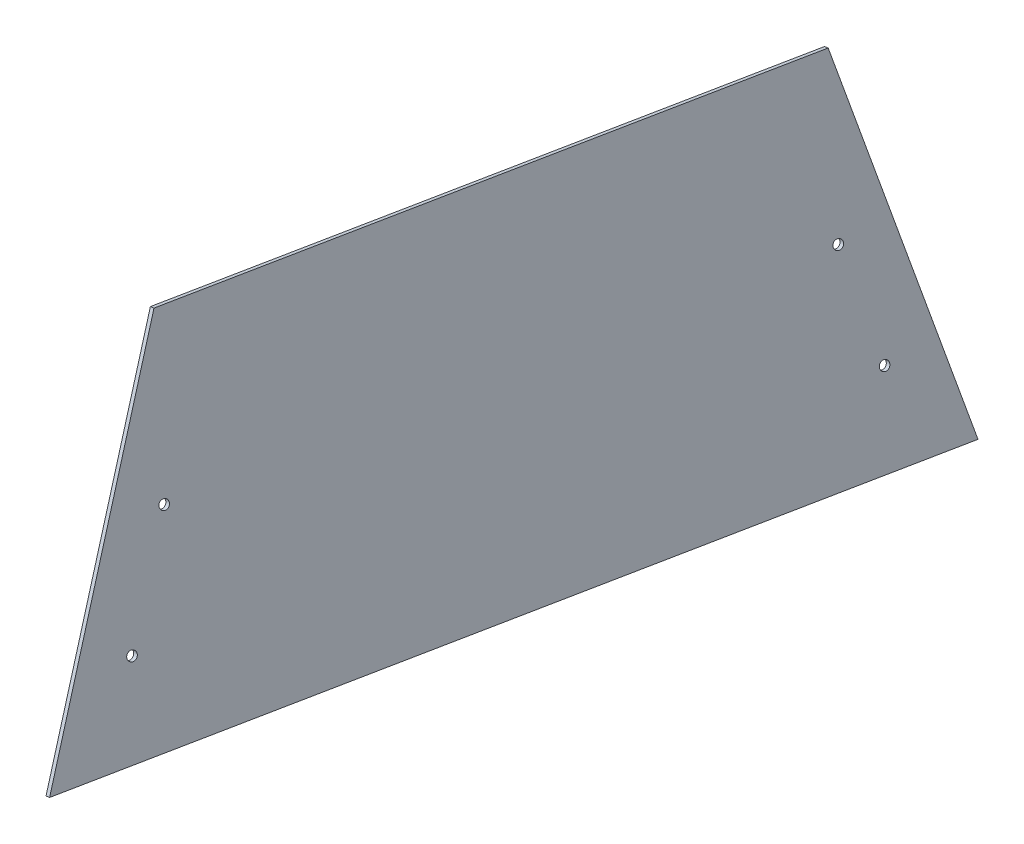
ISO-10303-21;
HEADER;
FILE_DESCRIPTION(('STEP AP214'),'2;1');
FILE_NAME('part.step','',(''),(''),'','','');
FILE_SCHEMA(('AUTOMOTIVE_DESIGN { 1 0 10303 214 1 1 1 1 }'));
ENDSEC;
DATA;
#1=APPLICATION_CONTEXT('core data for automotive mechanical design processes');
#2=APPLICATION_PROTOCOL_DEFINITION('international standard','automotive_design',2000,#1);
#3=PRODUCT_CONTEXT('',#1,'mechanical');
#4=PRODUCT('Part','Part','',(#3));
#5=PRODUCT_RELATED_PRODUCT_CATEGORY('part','',(#4));
#6=PRODUCT_DEFINITION_FORMATION('','',#4);
#7=PRODUCT_DEFINITION_CONTEXT('part definition',#1,'design');
#8=PRODUCT_DEFINITION('design','',#6,#7);
#9=PRODUCT_DEFINITION_SHAPE('','',#8);
#10=(LENGTH_UNIT() NAMED_UNIT(*) SI_UNIT(.MILLI.,.METRE.));
#11=(NAMED_UNIT(*) PLANE_ANGLE_UNIT() SI_UNIT($,.RADIAN.));
#12=(NAMED_UNIT(*) SI_UNIT($,.STERADIAN.) SOLID_ANGLE_UNIT());
#13=UNCERTAINTY_MEASURE_WITH_UNIT(LENGTH_MEASURE(1.E-05),#10,'distance_accuracy_value','');
#14=(GEOMETRIC_REPRESENTATION_CONTEXT(3) GLOBAL_UNCERTAINTY_ASSIGNED_CONTEXT((#13)) GLOBAL_UNIT_ASSIGNED_CONTEXT((#10,
#11,#12)) REPRESENTATION_CONTEXT('',''));
#15=CARTESIAN_POINT('',(0.,0.,0.));
#16=DIRECTION('',(0.,0.,1.));
#17=DIRECTION('',(1.,0.,0.));
#18=AXIS2_PLACEMENT_3D('',#15,#16,#17);
#19=CARTESIAN_POINT('',(267.040647517618,626.359113568149,1464.37896161702));
#20=DIRECTION('',(0.293132454914823,-0.954292497221213,0.058302603911916));
#21=DIRECTION('',(0.955918556350323,0.293631935635609,0.));
#22=AXIS2_PLACEMENT_3D('',#19,#20,#21);
#23=PLANE('',#22);
#24=DIRECTION('',(-0.195073763499262,8.02316137227276E-08,0.980788573951709));
#25=VECTOR('',#24,1.);
#26=CARTESIAN_POINT('',(264.232769971137,625.462490755744,1463.82048940084));
#27=LINE('',#26,#25);
#28=CARTESIAN_POINT('',(264.232769971137,625.462490755744,1463.82048940084));
#29=VERTEX_POINT('',#28);
#30=CARTESIAN_POINT('',(194.741215900189,625.462519336828,1813.2089514694));
#31=VERTEX_POINT('',#30);
#32=EDGE_CURVE('E101',#29,#31,#27,.T.);
#33=ORIENTED_EDGE('',*,*,#32,.T.);
#34=DIRECTION('',(-0.935959182160121,-0.298874270801778,-0.186157405393561));
#35=VECTOR('',#34,1.);
#36=CARTESIAN_POINT('',(197.549093446669,626.359142149233,1813.76742368558));
#37=LINE('',#36,#35);
#38=CARTESIAN_POINT('',(197.549093446669,626.359142149233,1813.76742368558));
#39=VERTEX_POINT('',#38);
#40=EDGE_CURVE('E11',#39,#31,#37,.T.);
#41=ORIENTED_EDGE('',*,*,#40,.F.);
#42=DIRECTION('',(-0.195073763499262,8.02316137227276E-08,0.980788573951709));
#43=VECTOR('',#42,1.);
#44=CARTESIAN_POINT('',(267.040647517618,626.359113568149,1464.37896161702));
#45=LINE('',#44,#43);
#46=CARTESIAN_POINT('',(267.040647517618,626.359113568149,1464.37896161702));
#47=VERTEX_POINT('',#46);
#48=EDGE_CURVE('E88',#47,#39,#45,.T.);
#49=ORIENTED_EDGE('',*,*,#48,.F.);
#50=DIRECTION('',(-0.935959182160121,-0.298874270801778,-0.186157405393561));
#51=VECTOR('',#50,1.);
#52=CARTESIAN_POINT('',(267.040647517618,626.359113568149,1464.37896161702));
#53=LINE('',#52,#51);
#54=EDGE_CURVE('E97',#47,#29,#53,.T.);
#55=ORIENTED_EDGE('',*,*,#54,.T.);
#56=EDGE_LOOP('',(#33,#41,#49,#55));
#57=FACE_BOUND('',#56,.T.);
#58=ADVANCED_FACE('F35',(#57),#23,.F.);
#59=CARTESIAN_POINT('',(197.549093446669,626.359142149233,1813.76742368558));
#60=DIRECTION('',(0.302048266778896,-0.409788813161848,-0.860720612709646));
#61=DIRECTION('',(0.,0.902892336228118,-0.429866757473209));
#62=AXIS2_PLACEMENT_3D('',#59,#60,#61);
#63=PLANE('',#62);
#64=DIRECTION('',(0.180962023270138,-0.86182788238726,0.473820057905813));
#65=VECTOR('',#64,1.);
#66=CARTESIAN_POINT('',(194.741215900189,625.462519336828,1813.2089514694));
#67=LINE('',#66,#65);
#68=CARTESIAN_POINT('',(234.816664307999,434.604027522417,1918.14009084357));
#69=VERTEX_POINT('',#68);
#70=EDGE_CURVE('E92',#31,#69,#67,.T.);
#71=ORIENTED_EDGE('',*,*,#70,.T.);
#72=DIRECTION('',(-0.935959182160121,-0.298874270801778,-0.186157405393561));
#73=VECTOR('',#72,1.);
#74=CARTESIAN_POINT('',(237.624541854479,435.500650334822,1918.69856305975));
#75=LINE('',#74,#73);
#76=CARTESIAN_POINT('',(237.624541854479,435.500650334822,1918.69856305975));
#77=VERTEX_POINT('',#76);
#78=EDGE_CURVE('E44',#77,#69,#75,.T.);
#79=ORIENTED_EDGE('',*,*,#78,.F.);
#80=DIRECTION('',(0.180962023270138,-0.86182788238726,0.473820057905813));
#81=VECTOR('',#80,1.);
#82=CARTESIAN_POINT('',(197.549093446669,626.359142149233,1813.76742368558));
#83=LINE('',#82,#81);
#84=EDGE_CURVE('E83',#39,#77,#83,.T.);
#85=ORIENTED_EDGE('',*,*,#84,.F.);
#86=ORIENTED_EDGE('',*,*,#40,.T.);
#87=EDGE_LOOP('',(#71,#79,#85,#86));
#88=FACE_BOUND('',#87,.T.);
#89=ADVANCED_FACE('F91',(#88),#63,.F.);
#90=CARTESIAN_POINT('',(237.624541854479,435.500650334822,1918.69856305975));
#91=DIRECTION('',(-0.293132454914823,0.954292497221213,-0.0583026039119154));
#92=DIRECTION('',(-0.955918556350323,-0.293631935635609,0.));
#93=AXIS2_PLACEMENT_3D('',#90,#91,#92);
#94=PLANE('',#93);
#95=DIRECTION('',(0.195073763499262,-8.02316132297327E-08,-0.980788573951709));
#96=VECTOR('',#95,1.);
#97=CARTESIAN_POINT('',(234.816664307999,434.604027522417,1918.14009084357));
#98=LINE('',#97,#96);
#99=CARTESIAN_POINT('',(330.512514301934,434.603988163806,1437.00211223988));
#100=VERTEX_POINT('',#99);
#101=EDGE_CURVE('E70',#69,#100,#98,.T.);
#102=ORIENTED_EDGE('',*,*,#101,.T.);
#103=DIRECTION('',(-0.935959182160121,-0.298874270801778,-0.186157405393561));
#104=VECTOR('',#103,1.);
#105=CARTESIAN_POINT('',(333.320391848414,435.500610976211,1437.56058445606));
#106=LINE('',#105,#104);
#107=CARTESIAN_POINT('',(333.320391848414,435.500610976211,1437.56058445606));
#108=VERTEX_POINT('',#107);
#109=EDGE_CURVE('E93',#108,#100,#106,.T.);
#110=ORIENTED_EDGE('',*,*,#109,.F.);
#111=DIRECTION('',(0.195073763499262,-8.02316132297327E-08,-0.980788573951709));
#112=VECTOR('',#111,1.);
#113=CARTESIAN_POINT('',(237.624541854479,435.500650334822,1918.69856305975));
#114=LINE('',#113,#112);
#115=EDGE_CURVE('E86',#77,#108,#114,.T.);
#116=ORIENTED_EDGE('',*,*,#115,.F.);
#117=ORIENTED_EDGE('',*,*,#78,.T.);
#118=EDGE_LOOP('',(#102,#110,#116,#117));
#119=FACE_BOUND('',#118,.T.);
#120=ADVANCED_FACE('F95',(#119),#94,.F.);
#121=CARTESIAN_POINT('',(333.320391848414,435.500610976211,1437.56058445606));
#122=DIRECTION('',(-0.134999140998528,-0.183695914556916,0.973668856904008));
#123=DIRECTION('',(0.,-0.982664446815739,-0.185393055329261));
#124=AXIS2_PLACEMENT_3D('',#121,#122,#123);
#125=PLANE('',#124);
#126=DIRECTION('',(-0.325200924444898,0.936445396821301,0.131584108130046));
#127=VECTOR('',#126,1.);
#128=CARTESIAN_POINT('',(330.512514301934,434.603988163806,1437.00211223988));
#129=LINE('',#128,#127);
#130=EDGE_CURVE('E76',#100,#29,#129,.T.);
#131=ORIENTED_EDGE('',*,*,#130,.T.);
#132=ORIENTED_EDGE('',*,*,#54,.F.);
#133=DIRECTION('',(-0.325200924444898,0.936445396821301,0.131584108130046));
#134=VECTOR('',#133,1.);
#135=CARTESIAN_POINT('',(333.320391848414,435.500610976211,1437.56058445606));
#136=LINE('',#135,#134);
#137=EDGE_CURVE('E53',#108,#47,#136,.T.);
#138=ORIENTED_EDGE('',*,*,#137,.F.);
#139=ORIENTED_EDGE('',*,*,#109,.T.);
#140=EDGE_LOOP('',(#131,#132,#138,#139));
#141=FACE_BOUND('',#140,.T.);
#142=ADVANCED_FACE('F151',(#141),#125,.F.);
#143=CARTESIAN_POINT('',(664.293994586951,212.125044568673,132.124614842098));
#144=DIRECTION('',(-0.935959182160121,-0.298874270801777,-0.186157405393561));
#145=DIRECTION('',(0.304191559381334,-0.952610883415234,0.));
#146=AXIS2_PLACEMENT_3D('',#143,#144,#145);
#147=PLANE('',#146);
#148=CARTESIAN_POINT('',(233.693123459791,482.152389068805,1863.56587989501));
#149=DIRECTION('',(-0.935959182160121,-0.298874270801777,-0.186157405393561));
#150=DIRECTION('',(0.304191559381334,-0.952610883415234,0.));
#151=AXIS2_PLACEMENT_3D('',#148,#149,#150);
#152=CIRCLE('',#151,2.74999999999996);
#153=CARTESIAN_POINT('',(232.856596671492,484.772068998197,1863.56587989501));
#154=VERTEX_POINT('',#153);
#155=EDGE_CURVE('E104',#154,#154,#152,.T.);
#156=ORIENTED_EDGE('',*,*,#155,.T.);
#157=EDGE_LOOP('',(#156));
#158=FACE_BOUND('',#157,.T.);
#159=CARTESIAN_POINT('',(311.267351585214,482.15235716341,1473.53948570579));
#160=DIRECTION('',(-0.935959182160121,-0.298874270801777,-0.186157405393561));
#161=DIRECTION('',(0.304191559381334,-0.952610883415234,0.));
#162=AXIS2_PLACEMENT_3D('',#159,#160,#161);
#163=CIRCLE('',#162,2.74999999999994);
#164=CARTESIAN_POINT('',(310.430824796915,484.772037092802,1473.53948570579));
#165=VERTEX_POINT('',#164);
#166=EDGE_CURVE('E119',#165,#165,#163,.T.);
#167=ORIENTED_EDGE('',*,*,#166,.T.);
#168=EDGE_LOOP('',(#167));
#169=FACE_BOUND('',#168,.T.);
#170=CARTESIAN_POINT('',(290.768935969917,541.179393995612,1481.8336372105));
#171=DIRECTION('',(-0.935959182160121,-0.298874270801777,-0.186157405393561));
#172=DIRECTION('',(0.304191559381334,-0.952610883415234,0.));
#173=AXIS2_PLACEMENT_3D('',#170,#171,#172);
#174=CIRCLE('',#173,2.74999999999994);
#175=CARTESIAN_POINT('',(289.932409181618,543.799073925004,1481.8336372105));
#176=VERTEX_POINT('',#175);
#177=EDGE_CURVE('E116',#176,#176,#174,.T.);
#178=ORIENTED_EDGE('',*,*,#177,.T.);
#179=EDGE_LOOP('',(#178));
#180=FACE_BOUND('',#179,.T.);
#181=CARTESIAN_POINT('',(221.28688916416,541.179422572786,1831.17429881167));
#182=DIRECTION('',(-0.935959182160121,-0.298874270801777,-0.186157405393561));
#183=DIRECTION('',(0.304191559381334,-0.952610883415234,0.));
#184=AXIS2_PLACEMENT_3D('',#181,#182,#183);
#185=CIRCLE('',#184,2.74999999999994);
#186=CARTESIAN_POINT('',(220.450362375862,543.799102502178,1831.17429881167));
#187=VERTEX_POINT('',#186);
#188=EDGE_CURVE('E113',#187,#187,#185,.T.);
#189=ORIENTED_EDGE('',*,*,#188,.T.);
#190=EDGE_LOOP('',(#189));
#191=FACE_BOUND('',#190,.T.);
#192=ORIENTED_EDGE('',*,*,#48,.T.);
#193=ORIENTED_EDGE('',*,*,#84,.T.);
#194=ORIENTED_EDGE('',*,*,#115,.T.);
#195=ORIENTED_EDGE('',*,*,#137,.T.);
#196=EDGE_LOOP('',(#192,#193,#194,#195));
#197=FACE_BOUND('',#196,.T.);
#198=ADVANCED_FACE('F84',(#158,#169,#180,#191,#197),#147,.F.);
#199=CARTESIAN_POINT('',(661.486117040471,211.228421756268,131.566142625918));
#200=DIRECTION('',(-0.935959182160121,-0.298874270801777,-0.186157405393561));
#201=DIRECTION('',(0.304191559381334,-0.952610883415234,0.));
#202=AXIS2_PLACEMENT_3D('',#199,#200,#201);
#203=PLANE('',#202);
#204=CARTESIAN_POINT('',(230.88524591331,481.2557662564,1863.00740767883));
#205=DIRECTION('',(-0.935959182160121,-0.298874270801777,-0.186157405393561));
#206=DIRECTION('',(0.304191559381334,-0.952610883415234,0.));
#207=AXIS2_PLACEMENT_3D('',#204,#205,#206);
#208=CIRCLE('',#207,2.74999999999996);
#209=CARTESIAN_POINT('',(230.048719125012,483.875446185792,1863.00740767883));
#210=VERTEX_POINT('',#209);
#211=EDGE_CURVE('E38',#210,#210,#208,.T.);
#212=ORIENTED_EDGE('',*,*,#211,.F.);
#213=EDGE_LOOP('',(#212));
#214=FACE_BOUND('',#213,.T.);
#215=CARTESIAN_POINT('',(308.459474038734,481.255734351005,1472.98101348961));
#216=DIRECTION('',(-0.935959182160121,-0.298874270801777,-0.186157405393561));
#217=DIRECTION('',(0.304191559381334,-0.952610883415234,0.));
#218=AXIS2_PLACEMENT_3D('',#215,#216,#217);
#219=CIRCLE('',#218,2.74999999999994);
#220=CARTESIAN_POINT('',(307.622947250435,483.875414280397,1472.98101348961));
#221=VERTEX_POINT('',#220);
#222=EDGE_CURVE('E117',#221,#221,#219,.T.);
#223=ORIENTED_EDGE('',*,*,#222,.F.);
#224=EDGE_LOOP('',(#223));
#225=FACE_BOUND('',#224,.T.);
#226=CARTESIAN_POINT('',(287.961058423436,540.282771183207,1481.27516499432));
#227=DIRECTION('',(-0.935959182160121,-0.298874270801777,-0.186157405393561));
#228=DIRECTION('',(0.304191559381334,-0.952610883415234,0.));
#229=AXIS2_PLACEMENT_3D('',#226,#227,#228);
#230=CIRCLE('',#229,2.74999999999994);
#231=CARTESIAN_POINT('',(287.124531635138,542.902451112598,1481.27516499432));
#232=VERTEX_POINT('',#231);
#233=EDGE_CURVE('E114',#232,#232,#230,.T.);
#234=ORIENTED_EDGE('',*,*,#233,.F.);
#235=EDGE_LOOP('',(#234));
#236=FACE_BOUND('',#235,.T.);
#237=CARTESIAN_POINT('',(218.47901161768,540.282799760381,1830.61582659549));
#238=DIRECTION('',(-0.935959182160121,-0.298874270801777,-0.186157405393561));
#239=DIRECTION('',(0.304191559381334,-0.952610883415234,0.));
#240=AXIS2_PLACEMENT_3D('',#237,#238,#239);
#241=CIRCLE('',#240,2.74999999999994);
#242=CARTESIAN_POINT('',(217.642484829381,542.902479689773,1830.61582659549));
#243=VERTEX_POINT('',#242);
#244=EDGE_CURVE('E110',#243,#243,#241,.T.);
#245=ORIENTED_EDGE('',*,*,#244,.F.);
#246=EDGE_LOOP('',(#245));
#247=FACE_BOUND('',#246,.T.);
#248=ORIENTED_EDGE('',*,*,#32,.F.);
#249=ORIENTED_EDGE('',*,*,#130,.F.);
#250=ORIENTED_EDGE('',*,*,#101,.F.);
#251=ORIENTED_EDGE('',*,*,#70,.F.);
#252=EDGE_LOOP('',(#248,#249,#250,#251));
#253=FACE_BOUND('',#252,.T.);
#254=ADVANCED_FACE('F139',(#214,#225,#236,#247,#253),#203,.T.);
#255=CARTESIAN_POINT('',(99.54069436707,502.302935342976,1806.95961491097));
#256=DIRECTION('',(0.935959182160121,0.298874270801778,0.186157405393561));
#257=DIRECTION('',(-0.304191559381334,0.952610883415234,0.));
#258=AXIS2_PLACEMENT_3D('',#255,#256,#257);
#259=CYLINDRICAL_SURFACE('',#258,2.74999999999994);
#260=CARTESIAN_POINT('',(217.642484829381,542.902479689773,1830.61582659549));
#261=CARTESIAN_POINT('',(217.671733553824,542.911819510735,1830.62164401441));
#262=CARTESIAN_POINT('',(217.700982278266,542.921159331698,1830.62746143333));
#263=CARTESIAN_POINT('',(217.759479727151,542.939838973623,1830.63909627117));
#264=CARTESIAN_POINT('',(217.788728451594,542.949178794586,1830.64491369008));
#265=CARTESIAN_POINT('',(217.847225900479,542.967858436511,1830.65654852792));
#266=CARTESIAN_POINT('',(217.876474624921,542.977198257473,1830.66236594684));
#267=CARTESIAN_POINT('',(217.934972073806,542.995877899398,1830.67400078468));
#268=CARTESIAN_POINT('',(217.964220798249,543.005217720361,1830.6798182036));
#269=CARTESIAN_POINT('',(218.022718247134,543.023897362286,1830.69145304143));
#270=CARTESIAN_POINT('',(218.051966971576,543.033237183249,1830.69727046035));
#271=CARTESIAN_POINT('',(218.110464420461,543.051916825174,1830.70890529819));
#272=CARTESIAN_POINT('',(218.139713144904,543.061256646136,1830.71472271711));
#273=CARTESIAN_POINT('',(218.198210593789,543.079936288061,1830.72635755494));
#274=CARTESIAN_POINT('',(218.227459318231,543.089276109024,1830.73217497386));
#275=CARTESIAN_POINT('',(218.285956767116,543.107955750949,1830.7438098117));
#276=CARTESIAN_POINT('',(218.315205491559,543.117295571912,1830.74962723062));
#277=CARTESIAN_POINT('',(218.373702940444,543.135975213837,1830.76126206846));
#278=CARTESIAN_POINT('',(218.402951664887,543.145315034799,1830.76707948737));
#279=CARTESIAN_POINT('',(218.461449113771,543.163994676724,1830.77871432521));
#280=CARTESIAN_POINT('',(218.490697838214,543.173334497687,1830.78453174413));
#281=CARTESIAN_POINT('',(218.549195287099,543.192014139612,1830.79616658197));
#282=CARTESIAN_POINT('',(218.578444011542,543.201353960575,1830.80198400089));
#283=CARTESIAN_POINT('',(218.636941460426,543.2200336025,1830.81361883872));
#284=CARTESIAN_POINT('',(218.666190184869,543.229373423462,1830.81943625764));
#285=CARTESIAN_POINT('',(218.724687633754,543.248053065387,1830.83107109548));
#286=CARTESIAN_POINT('',(218.753936358196,543.25739288635,1830.8368885144));
#287=CARTESIAN_POINT('',(218.812433807082,543.276072528275,1830.84852335223));
#288=CARTESIAN_POINT('',(218.841682531524,543.285412349238,1830.85434077115));
#289=CARTESIAN_POINT('',(218.900179980409,543.304091991163,1830.86597560899));
#290=CARTESIAN_POINT('',(218.929428704852,543.313431812125,1830.87179302791));
#291=CARTESIAN_POINT('',(218.987926153737,543.332111454051,1830.88342786575));
#292=CARTESIAN_POINT('',(219.017174878179,543.341451275013,1830.88924528466));
#293=CARTESIAN_POINT('',(219.075672327064,543.360130916938,1830.9008801225));
#294=CARTESIAN_POINT('',(219.104921051507,543.369470737901,1830.90669754142));
#295=CARTESIAN_POINT('',(219.163418500392,543.388150379826,1830.91833237926));
#296=CARTESIAN_POINT('',(219.192667224834,543.397490200788,1830.92414979818));
#297=CARTESIAN_POINT('',(219.251164673719,543.416169842713,1830.93578463601));
#298=CARTESIAN_POINT('',(219.280413398162,543.425509663676,1830.94160205493));
#299=CARTESIAN_POINT('',(219.338910847047,543.444189305601,1830.95323689277));
#300=CARTESIAN_POINT('',(219.368159571489,543.453529126564,1830.95905431169));
#301=CARTESIAN_POINT('',(219.426657020374,543.472208768489,1830.97068914952));
#302=CARTESIAN_POINT('',(219.455905744817,543.481548589451,1830.97650656844));
#303=CARTESIAN_POINT('',(219.514403193702,543.500228231376,1830.98814140628));
#304=CARTESIAN_POINT('',(219.543651918144,543.509568052339,1830.9939588252));
#305=CARTESIAN_POINT('',(219.602149367029,543.528247694264,1831.00559366303));
#306=CARTESIAN_POINT('',(219.631398091472,543.537587515227,1831.01141108195));
#307=CARTESIAN_POINT('',(219.689895540357,543.556267157152,1831.02304591979));
#308=CARTESIAN_POINT('',(219.719144264799,543.565606978114,1831.02886333871));
#309=CARTESIAN_POINT('',(219.777641713684,543.584286620039,1831.04049817655));
#310=CARTESIAN_POINT('',(219.806890438127,543.593626441002,1831.04631559546));
#311=CARTESIAN_POINT('',(219.865387887012,543.612306082927,1831.0579504333));
#312=CARTESIAN_POINT('',(219.894636611454,543.62164590389,1831.06376785222));
#313=CARTESIAN_POINT('',(219.953134060339,543.640325545815,1831.07540269006));
#314=CARTESIAN_POINT('',(219.982382784782,543.649665366777,1831.08122010898));
#315=CARTESIAN_POINT('',(220.040880233667,543.668345008702,1831.09285494681));
#316=CARTESIAN_POINT('',(220.070128958109,543.677684829665,1831.09867236573));
#317=CARTESIAN_POINT('',(220.128626406994,543.69636447159,1831.11030720357));
#318=CARTESIAN_POINT('',(220.157875131437,543.705704292553,1831.11612462249));
#319=CARTESIAN_POINT('',(220.216372580322,543.724383934478,1831.12775946032));
#320=CARTESIAN_POINT('',(220.245621304764,543.73372375544,1831.13357687924));
#321=CARTESIAN_POINT('',(220.304118753649,543.752403397365,1831.14521171708));
#322=CARTESIAN_POINT('',(220.333367478092,543.761743218328,1831.151029136));
#323=CARTESIAN_POINT('',(220.391864926977,543.780422860253,1831.16266397384));
#324=CARTESIAN_POINT('',(220.421113651419,543.789762681216,1831.16848139275));
#325=CARTESIAN_POINT('',(220.450362375862,543.799102502178,1831.17429881167));
#326=B_SPLINE_CURVE_WITH_KNOTS('',3,(#260,#261,#262,#263,#264,#265,#266,#267,#268,#269,#270,
#271,#272,#273,#274,#275,#276,#277,#278,#279,#280,#281,#282,#283,#284,#285,#286,#287,#288,#289,
#290,#291,#292,#293,#294,#295,#296,#297,#298,#299,#300,#301,#302,#303,#304,#305,#306,#307,#308,
#309,#310,#311,#312,#313,#314,#315,#316,#317,#318,#319,#320,#321,#322,#323,#324,#325),
.UNSPECIFIED.,.F.,.F.,(4,2,2,2,2,2,2,2,2,2,2,2,2,2,2,2,2,2,2,2,2,2,2,2,2,2,2,2,2,2,2,2,4),(0.,
0.0937499999999849,0.187500000000011,0.281249999999996,0.375000000000022,0.468749999999955,
0.562499999999981,0.656249999999966,0.749999999999993,0.843749999999977,0.937500000000004,
1.03124999999999,1.12499999999996,1.21874999999995,1.31249999999997,1.40624999999999,
1.50000000000002,1.59375,1.68750000000003,1.78125000000001,1.87500000000004,1.96874999999997,
2.0625,2.15624999999998,2.25000000000001,2.34375,2.43750000000002,2.53125000000001,
2.62499999999998,2.71874999999997,2.81249999999999,2.90624999999998,3.),.UNSPECIFIED.);
#327=EDGE_CURVE('BSEAM142',#243,#187,#326,.T.);
#328=ORIENTED_EDGE('',*,*,#244,.T.);
#329=ORIENTED_EDGE('',*,*,#188,.F.);
#330=ORIENTED_EDGE('',*,*,#327,.T.);
#331=ORIENTED_EDGE('',*,*,#327,.F.);
#332=EDGE_LOOP('',(#328,#330,#329,#331));
#333=FACE_BOUND('',#332,.T.);
#334=ADVANCED_FACE('F142',(#333),#259,.F.);
#335=CARTESIAN_POINT('',(169.022741172826,502.302906765802,1457.6189533098));
#336=DIRECTION('',(0.935959182160121,0.298874270801778,0.186157405393561));
#337=DIRECTION('',(-0.304191559381334,0.952610883415234,0.));
#338=AXIS2_PLACEMENT_3D('',#335,#336,#337);
#339=CYLINDRICAL_SURFACE('',#338,2.74999999999994);
#340=CARTESIAN_POINT('',(287.124531635138,542.902451112598,1481.27516499432));
#341=CARTESIAN_POINT('',(287.15378035958,542.911790933561,1481.28098241324));
#342=CARTESIAN_POINT('',(287.183029084023,542.921130754524,1481.28679983215));
#343=CARTESIAN_POINT('',(287.241526532908,542.939810396449,1481.29843466999));
#344=CARTESIAN_POINT('',(287.27077525735,542.949150217411,1481.30425208891));
#345=CARTESIAN_POINT('',(287.329272706235,542.967829859336,1481.31588692675));
#346=CARTESIAN_POINT('',(287.358521430678,542.977169680299,1481.32170434567));
#347=CARTESIAN_POINT('',(287.417018879563,542.995849322224,1481.3333391835));
#348=CARTESIAN_POINT('',(287.446267604005,543.005189143186,1481.33915660242));
#349=CARTESIAN_POINT('',(287.50476505289,543.023868785112,1481.35079144026));
#350=CARTESIAN_POINT('',(287.534013777333,543.033208606074,1481.35660885918));
#351=CARTESIAN_POINT('',(287.592511226218,543.051888247999,1481.36824369701));
#352=CARTESIAN_POINT('',(287.62175995066,543.061228068962,1481.37406111593));
#353=CARTESIAN_POINT('',(287.680257399545,543.079907710887,1481.38569595377));
#354=CARTESIAN_POINT('',(287.709506123988,543.08924753185,1481.39151337269));
#355=CARTESIAN_POINT('',(287.768003572873,543.107927173775,1481.40314821053));
#356=CARTESIAN_POINT('',(287.797252297315,543.117266994737,1481.40896562944));
#357=CARTESIAN_POINT('',(287.8557497462,543.135946636662,1481.42060046728));
#358=CARTESIAN_POINT('',(287.884998470643,543.145286457625,1481.4264178862));
#359=CARTESIAN_POINT('',(287.943495919528,543.16396609955,1481.43805272404));
#360=CARTESIAN_POINT('',(287.97274464397,543.173305920512,1481.44387014296));
#361=CARTESIAN_POINT('',(288.031242092855,543.191985562437,1481.45550498079));
#362=CARTESIAN_POINT('',(288.060490817298,543.2013253834,1481.46132239971));
#363=CARTESIAN_POINT('',(288.118988266183,543.220005025325,1481.47295723755));
#364=CARTESIAN_POINT('',(288.148236990625,543.229344846288,1481.47877465647));
#365=CARTESIAN_POINT('',(288.20673443951,543.248024488213,1481.4904094943));
#366=CARTESIAN_POINT('',(288.235983163953,543.257364309176,1481.49622691322));
#367=CARTESIAN_POINT('',(288.294480612838,543.276043951101,1481.50786175106));
#368=CARTESIAN_POINT('',(288.32372933728,543.285383772063,1481.51367916998));
#369=CARTESIAN_POINT('',(288.382226786165,543.304063413988,1481.52531400782));
#370=CARTESIAN_POINT('',(288.411475510608,543.313403234951,1481.53113142673));
#371=CARTESIAN_POINT('',(288.469972959493,543.332082876876,1481.54276626457));
#372=CARTESIAN_POINT('',(288.499221683935,543.341422697839,1481.54858368349));
#373=CARTESIAN_POINT('',(288.55771913282,543.360102339764,1481.56021852133));
#374=CARTESIAN_POINT('',(288.586967857263,543.369442160726,1481.56603594025));
#375=CARTESIAN_POINT('',(288.645465306148,543.388121802651,1481.57767077808));
#376=CARTESIAN_POINT('',(288.67471403059,543.397461623614,1481.583488197));
#377=CARTESIAN_POINT('',(288.733211479475,543.416141265539,1481.59512303484));
#378=CARTESIAN_POINT('',(288.762460203918,543.425481086502,1481.60094045376));
#379=CARTESIAN_POINT('',(288.820957652803,543.444160728427,1481.61257529159));
#380=CARTESIAN_POINT('',(288.850206377245,543.453500549389,1481.61839271051));
#381=CARTESIAN_POINT('',(288.90870382613,543.472180191314,1481.63002754835));
#382=CARTESIAN_POINT('',(288.937952550573,543.481520012277,1481.63584496727));
#383=CARTESIAN_POINT('',(288.996449999458,543.500199654202,1481.6474798051));
#384=CARTESIAN_POINT('',(289.0256987239,543.509539475165,1481.65329722402));
#385=CARTESIAN_POINT('',(289.084196172785,543.52821911709,1481.66493206186));
#386=CARTESIAN_POINT('',(289.113444897228,543.537558938052,1481.67074948078));
#387=CARTESIAN_POINT('',(289.171942346113,543.556238579977,1481.68238431862));
#388=CARTESIAN_POINT('',(289.201191070555,543.56557840094,1481.68820173753));
#389=CARTESIAN_POINT('',(289.25968851944,543.584258042865,1481.69983657537));
#390=CARTESIAN_POINT('',(289.288937243883,543.593597863828,1481.70565399429));
#391=CARTESIAN_POINT('',(289.347434692768,543.612277505753,1481.71728883213));
#392=CARTESIAN_POINT('',(289.376683417211,543.621617326715,1481.72310625105));
#393=CARTESIAN_POINT('',(289.435180866095,543.64029696864,1481.73474108888));
#394=CARTESIAN_POINT('',(289.464429590538,543.649636789603,1481.7405585078));
#395=CARTESIAN_POINT('',(289.522927039423,543.668316431528,1481.75219334564));
#396=CARTESIAN_POINT('',(289.552175763866,543.677656252491,1481.75801076456));
#397=CARTESIAN_POINT('',(289.61067321275,543.696335894416,1481.76964560239));
#398=CARTESIAN_POINT('',(289.639921937193,543.705675715378,1481.77546302131));
#399=CARTESIAN_POINT('',(289.698419386078,543.724355357303,1481.78709785915));
#400=CARTESIAN_POINT('',(289.727668110521,543.733695178266,1481.79291527807));
#401=CARTESIAN_POINT('',(289.786165559406,543.752374820191,1481.80455011591));
#402=CARTESIAN_POINT('',(289.815414283848,543.761714641154,1481.81036753482));
#403=CARTESIAN_POINT('',(289.873911732733,543.780394283079,1481.82200237266));
#404=CARTESIAN_POINT('',(289.903160457176,543.789734104041,1481.82781979158));
#405=CARTESIAN_POINT('',(289.932409181618,543.799073925004,1481.8336372105));
#406=B_SPLINE_CURVE_WITH_KNOTS('',3,(#340,#341,#342,#343,#344,#345,#346,#347,#348,#349,#350,
#351,#352,#353,#354,#355,#356,#357,#358,#359,#360,#361,#362,#363,#364,#365,#366,#367,#368,#369,
#370,#371,#372,#373,#374,#375,#376,#377,#378,#379,#380,#381,#382,#383,#384,#385,#386,#387,#388,
#389,#390,#391,#392,#393,#394,#395,#396,#397,#398,#399,#400,#401,#402,#403,#404,#405),
.UNSPECIFIED.,.F.,.F.,(4,2,2,2,2,2,2,2,2,2,2,2,2,2,2,2,2,2,2,2,2,2,2,2,2,2,2,2,2,2,2,2,4),(0.,
0.0937499999999849,0.187500000000011,0.281249999999944,0.37499999999997,0.468749999999955,
0.562499999999981,0.656249999999966,0.749999999999941,0.843749999999926,0.937499999999952,
1.03124999999994,1.12499999999996,1.21874999999998,1.31250000000001,1.40624999999994,
1.49999999999997,1.59374999999995,1.68749999999998,1.78124999999991,1.87499999999994,
1.96874999999992,2.06249999999995,2.15624999999993,2.24999999999996,2.34374999999994,
2.43749999999997,2.53124999999996,2.62499999999998,2.71874999999997,2.81249999999994,
2.90624999999992,2.99999999999995),.UNSPECIFIED.);
#407=EDGE_CURVE('BSEAM195',#232,#176,#406,.T.);
#408=ORIENTED_EDGE('',*,*,#233,.T.);
#409=ORIENTED_EDGE('',*,*,#177,.F.);
#410=ORIENTED_EDGE('',*,*,#407,.T.);
#411=ORIENTED_EDGE('',*,*,#407,.F.);
#412=EDGE_LOOP('',(#408,#410,#409,#411));
#413=FACE_BOUND('',#412,.T.);
#414=ADVANCED_FACE('F195',(#413),#339,.F.);
#415=CARTESIAN_POINT('',(189.521156788124,443.2758699336,1449.32480180509));
#416=DIRECTION('',(0.935959182160121,0.298874270801778,0.186157405393561));
#417=DIRECTION('',(-0.304191559381334,0.952610883415234,0.));
#418=AXIS2_PLACEMENT_3D('',#415,#416,#417);
#419=CYLINDRICAL_SURFACE('',#418,2.74999999999994);
#420=CARTESIAN_POINT('',(307.622947250435,483.875414280397,1472.98101348961));
#421=CARTESIAN_POINT('',(307.652195974878,483.884754101359,1472.98683090853));
#422=CARTESIAN_POINT('',(307.68144469932,483.894093922322,1472.99264832744));
#423=CARTESIAN_POINT('',(307.739942148205,483.912773564247,1473.00428316528));
#424=CARTESIAN_POINT('',(307.769190872648,483.922113385209,1473.0101005842));
#425=CARTESIAN_POINT('',(307.827688321533,483.940793027135,1473.02173542204));
#426=CARTESIAN_POINT('',(307.856937045975,483.950132848097,1473.02755284096));
#427=CARTESIAN_POINT('',(307.91543449486,483.968812490022,1473.03918767879));
#428=CARTESIAN_POINT('',(307.944683219303,483.978152310985,1473.04500509771));
#429=CARTESIAN_POINT('',(308.003180668188,483.99683195291,1473.05663993555));
#430=CARTESIAN_POINT('',(308.03242939263,484.006171773872,1473.06245735447));
#431=CARTESIAN_POINT('',(308.090926841515,484.024851415798,1473.0740921923));
#432=CARTESIAN_POINT('',(308.120175565958,484.03419123676,1473.07990961122));
#433=CARTESIAN_POINT('',(308.178673014843,484.052870878685,1473.09154444906));
#434=CARTESIAN_POINT('',(308.207921739285,484.062210699648,1473.09736186798));
#435=CARTESIAN_POINT('',(308.26641918817,484.080890341573,1473.10899670582));
#436=CARTESIAN_POINT('',(308.295667912613,484.090230162535,1473.11481412473));
#437=CARTESIAN_POINT('',(308.354165361498,484.108909804461,1473.12644896257));
#438=CARTESIAN_POINT('',(308.38341408594,484.118249625423,1473.13226638149));
#439=CARTESIAN_POINT('',(308.441911534825,484.136929267348,1473.14390121933));
#440=CARTESIAN_POINT('',(308.471160259268,484.146269088311,1473.14971863825));
#441=CARTESIAN_POINT('',(308.529657708153,484.164948730236,1473.16135347608));
#442=CARTESIAN_POINT('',(308.558906432595,484.174288551198,1473.167170895));
#443=CARTESIAN_POINT('',(308.61740388148,484.192968193124,1473.17880573284));
#444=CARTESIAN_POINT('',(308.646652605923,484.202308014086,1473.18462315176));
#445=CARTESIAN_POINT('',(308.705150054808,484.220987656011,1473.19625798959));
#446=CARTESIAN_POINT('',(308.73439877925,484.230327476974,1473.20207540851));
#447=CARTESIAN_POINT('',(308.792896228135,484.249007118899,1473.21371024635));
#448=CARTESIAN_POINT('',(308.822144952578,484.258346939861,1473.21952766527));
#449=CARTESIAN_POINT('',(308.880642401463,484.277026581787,1473.2311625031));
#450=CARTESIAN_POINT('',(308.909891125905,484.286366402749,1473.23697992202));
#451=CARTESIAN_POINT('',(308.96838857479,484.305046044674,1473.24861475986));
#452=CARTESIAN_POINT('',(308.997637299233,484.314385865637,1473.25443217878));
#453=CARTESIAN_POINT('',(309.056134748118,484.333065507562,1473.26606701662));
#454=CARTESIAN_POINT('',(309.08538347256,484.342405328524,1473.27188443553));
#455=CARTESIAN_POINT('',(309.143880921445,484.36108497045,1473.28351927337));
#456=CARTESIAN_POINT('',(309.173129645888,484.370424791412,1473.28933669229));
#457=CARTESIAN_POINT('',(309.231627094773,484.389104433337,1473.30097153013));
#458=CARTESIAN_POINT('',(309.260875819215,484.3984442543,1473.30678894905));
#459=CARTESIAN_POINT('',(309.3193732681,484.417123896225,1473.31842378688));
#460=CARTESIAN_POINT('',(309.348621992543,484.426463717187,1473.3242412058));
#461=CARTESIAN_POINT('',(309.407119441428,484.445143359113,1473.33587604364));
#462=CARTESIAN_POINT('',(309.43636816587,484.454483180075,1473.34169346256));
#463=CARTESIAN_POINT('',(309.494865614755,484.473162822,1473.35332830039));
#464=CARTESIAN_POINT('',(309.524114339198,484.482502642963,1473.35914571931));
#465=CARTESIAN_POINT('',(309.582611788083,484.501182284888,1473.37078055715));
#466=CARTESIAN_POINT('',(309.611860512525,484.51052210585,1473.37659797607));
#467=CARTESIAN_POINT('',(309.67035796141,484.529201747776,1473.38823281391));
#468=CARTESIAN_POINT('',(309.699606685853,484.538541568738,1473.39405023282));
#469=CARTESIAN_POINT('',(309.758104134738,484.557221210663,1473.40568507066));
#470=CARTESIAN_POINT('',(309.78735285918,484.566561031626,1473.41150248958));
#471=CARTESIAN_POINT('',(309.845850308065,484.585240673551,1473.42313732742));
#472=CARTESIAN_POINT('',(309.875099032508,484.594580494513,1473.42895474634));
#473=CARTESIAN_POINT('',(309.933596481393,484.613260136439,1473.44058958417));
#474=CARTESIAN_POINT('',(309.962845205835,484.622599957401,1473.44640700309));
#475=CARTESIAN_POINT('',(310.02134265472,484.641279599326,1473.45804184093));
#476=CARTESIAN_POINT('',(310.050591379163,484.650619420289,1473.46385925985));
#477=CARTESIAN_POINT('',(310.109088828048,484.669299062214,1473.47549409768));
#478=CARTESIAN_POINT('',(310.13833755249,484.678638883176,1473.4813115166));
#479=CARTESIAN_POINT('',(310.196835001375,484.697318525102,1473.49294635444));
#480=CARTESIAN_POINT('',(310.226083725818,484.706658346064,1473.49876377336));
#481=CARTESIAN_POINT('',(310.284581174703,484.725337987989,1473.5103986112));
#482=CARTESIAN_POINT('',(310.313829899145,484.734677808952,1473.51621603011));
#483=CARTESIAN_POINT('',(310.37232734803,484.753357450877,1473.52785086795));
#484=CARTESIAN_POINT('',(310.401576072473,484.762697271839,1473.53366828687));
#485=CARTESIAN_POINT('',(310.430824796915,484.772037092802,1473.53948570579));
#486=B_SPLINE_CURVE_WITH_KNOTS('',3,(#420,#421,#422,#423,#424,#425,#426,#427,#428,#429,#430,
#431,#432,#433,#434,#435,#436,#437,#438,#439,#440,#441,#442,#443,#444,#445,#446,#447,#448,#449,
#450,#451,#452,#453,#454,#455,#456,#457,#458,#459,#460,#461,#462,#463,#464,#465,#466,#467,#468,
#469,#470,#471,#472,#473,#474,#475,#476,#477,#478,#479,#480,#481,#482,#483,#484,#485),
.UNSPECIFIED.,.F.,.F.,(4,2,2,2,2,2,2,2,2,2,2,2,2,2,2,2,2,2,2,2,2,2,2,2,2,2,2,2,2,2,2,2,4),(0.,
0.0937499999999849,0.187500000000028,0.281250000000013,0.375000000000039,0.468749999999972,
0.562499999999998,0.656249999999983,0.750000000000009,0.843749999999994,0.937499999999968,
1.03124999999995,1.12499999999998,1.21874999999996,1.31249999999999,1.40624999999998,1.5,
1.59374999999999,1.68750000000003,1.78125000000001,1.87500000000004,1.96874999999997,2.0625,
2.15624999999998,2.25000000000001,2.34374999999994,2.43749999999997,2.53124999999996,
2.62499999999998,2.71874999999997,2.81249999999999,2.90624999999998,3.00000000000002),.UNSPECIFIED.);
#487=EDGE_CURVE('BSEAM205',#221,#165,#486,.T.);
#488=ORIENTED_EDGE('',*,*,#222,.T.);
#489=ORIENTED_EDGE('',*,*,#166,.F.);
#490=ORIENTED_EDGE('',*,*,#487,.T.);
#491=ORIENTED_EDGE('',*,*,#487,.F.);
#492=EDGE_LOOP('',(#488,#490,#489,#491));
#493=FACE_BOUND('',#492,.T.);
#494=ADVANCED_FACE('F205',(#493),#419,.F.);
#495=CARTESIAN_POINT('',(111.946928662701,443.275901838995,1839.35119599431));
#496=DIRECTION('',(0.935959182160121,0.298874270801778,0.186157405393561));
#497=DIRECTION('',(-0.304191559381334,0.952610883415234,0.));
#498=AXIS2_PLACEMENT_3D('',#495,#496,#497);
#499=CYLINDRICAL_SURFACE('',#498,2.74999999999996);
#500=CARTESIAN_POINT('',(230.048719125012,483.875446185792,1863.00740767883));
#501=CARTESIAN_POINT('',(230.077967849454,483.884786006754,1863.01322509775));
#502=CARTESIAN_POINT('',(230.107216573897,483.894125827717,1863.01904251667));
#503=CARTESIAN_POINT('',(230.165714022782,483.912805469642,1863.0306773545));
#504=CARTESIAN_POINT('',(230.194962747224,483.922145290604,1863.03649477342));
#505=CARTESIAN_POINT('',(230.253460196109,483.940824932529,1863.04812961126));
#506=CARTESIAN_POINT('',(230.282708920552,483.950164753492,1863.05394703018));
#507=CARTESIAN_POINT('',(230.341206369437,483.968844395417,1863.06558186802));
#508=CARTESIAN_POINT('',(230.370455093879,483.97818421638,1863.07139928693));
#509=CARTESIAN_POINT('',(230.428952542764,483.996863858305,1863.08303412477));
#510=CARTESIAN_POINT('',(230.458201267207,484.006203679267,1863.08885154369));
#511=CARTESIAN_POINT('',(230.516698716092,484.024883321192,1863.10048638153));
#512=CARTESIAN_POINT('',(230.545947440534,484.034223142155,1863.10630380045));
#513=CARTESIAN_POINT('',(230.604444889419,484.05290278408,1863.11793863828));
#514=CARTESIAN_POINT('',(230.633693613862,484.062242605043,1863.1237560572));
#515=CARTESIAN_POINT('',(230.692191062747,484.080922246968,1863.13539089504));
#516=CARTESIAN_POINT('',(230.721439787189,484.09026206793,1863.14120831396));
#517=CARTESIAN_POINT('',(230.779937236074,484.108941709855,1863.15284315179));
#518=CARTESIAN_POINT('',(230.809185960517,484.118281530818,1863.15866057071));
#519=CARTESIAN_POINT('',(230.867683409402,484.136961172743,1863.17029540855));
#520=CARTESIAN_POINT('',(230.896932133844,484.146300993706,1863.17611282747));
#521=CARTESIAN_POINT('',(230.955429582729,484.164980635631,1863.18774766531));
#522=CARTESIAN_POINT('',(230.984678307172,484.174320456593,1863.19356508422));
#523=CARTESIAN_POINT('',(231.043175756057,484.193000098518,1863.20519992206));
#524=CARTESIAN_POINT('',(231.072424480499,484.202339919481,1863.21101734098));
#525=CARTESIAN_POINT('',(231.130921929384,484.221019561406,1863.22265217882));
#526=CARTESIAN_POINT('',(231.160170653827,484.230359382369,1863.22846959774));
#527=CARTESIAN_POINT('',(231.218668102712,484.249039024294,1863.24010443557));
#528=CARTESIAN_POINT('',(231.247916827154,484.258378845256,1863.24592185449));
#529=CARTESIAN_POINT('',(231.306414276039,484.277058487181,1863.25755669233));
#530=CARTESIAN_POINT('',(231.335663000482,484.286398308144,1863.26337411125));
#531=CARTESIAN_POINT('',(231.394160449367,484.305077950069,1863.27500894908));
#532=CARTESIAN_POINT('',(231.423409173809,484.314417771032,1863.280826368));
#533=CARTESIAN_POINT('',(231.481906622694,484.333097412957,1863.29246120584));
#534=CARTESIAN_POINT('',(231.511155347137,484.342437233919,1863.29827862476));
#535=CARTESIAN_POINT('',(231.569652796022,484.361116875845,1863.30991346259));
#536=CARTESIAN_POINT('',(231.598901520464,484.370456696807,1863.31573088151));
#537=CARTESIAN_POINT('',(231.65739896935,484.389136338732,1863.32736571935));
#538=CARTESIAN_POINT('',(231.686647693792,484.398476159695,1863.33318313827));
#539=CARTESIAN_POINT('',(231.745145142677,484.41715580162,1863.34481797611));
#540=CARTESIAN_POINT('',(231.77439386712,484.426495622582,1863.35063539502));
#541=CARTESIAN_POINT('',(231.832891316005,484.445175264507,1863.36227023286));
#542=CARTESIAN_POINT('',(231.862140040447,484.45451508547,1863.36808765178));
#543=CARTESIAN_POINT('',(231.920637489332,484.473194727395,1863.37972248962));
#544=CARTESIAN_POINT('',(231.949886213775,484.482534548358,1863.38553990854));
#545=CARTESIAN_POINT('',(232.00838366266,484.501214190283,1863.39717474637));
#546=CARTESIAN_POINT('',(232.037632387102,484.510554011245,1863.40299216529));
#547=CARTESIAN_POINT('',(232.096129835987,484.52923365317,1863.41462700313));
#548=CARTESIAN_POINT('',(232.12537856043,484.538573474133,1863.42044442205));
#549=CARTESIAN_POINT('',(232.183876009315,484.557253116058,1863.43207925988));
#550=CARTESIAN_POINT('',(232.213124733757,484.566592937021,1863.4378966788));
#551=CARTESIAN_POINT('',(232.271622182642,484.585272578946,1863.44953151664));
#552=CARTESIAN_POINT('',(232.300870907085,484.594612399908,1863.45534893556));
#553=CARTESIAN_POINT('',(232.35936835597,484.613292041834,1863.4669837734));
#554=CARTESIAN_POINT('',(232.388617080412,484.622631862796,1863.47280119231));
#555=CARTESIAN_POINT('',(232.447114529297,484.641311504721,1863.48443603015));
#556=CARTESIAN_POINT('',(232.47636325374,484.650651325684,1863.49025344907));
#557=CARTESIAN_POINT('',(232.534860702625,484.669330967609,1863.50188828691));
#558=CARTESIAN_POINT('',(232.564109427067,484.678670788571,1863.50770570583));
#559=CARTESIAN_POINT('',(232.622606875952,484.697350430496,1863.51934054366));
#560=CARTESIAN_POINT('',(232.651855600395,484.706690251459,1863.52515796258));
#561=CARTESIAN_POINT('',(232.71035304928,484.725369893384,1863.53679280042));
#562=CARTESIAN_POINT('',(232.739601773722,484.734709714347,1863.54261021934));
#563=CARTESIAN_POINT('',(232.798099222607,484.753389356272,1863.55424505717));
#564=CARTESIAN_POINT('',(232.82734794705,484.762729177234,1863.56006247609));
#565=CARTESIAN_POINT('',(232.856596671492,484.772068998197,1863.56587989501));
#566=B_SPLINE_CURVE_WITH_KNOTS('',3,(#500,#501,#502,#503,#504,#505,#506,#507,#508,#509,#510,
#511,#512,#513,#514,#515,#516,#517,#518,#519,#520,#521,#522,#523,#524,#525,#526,#527,#528,#529,
#530,#531,#532,#533,#534,#535,#536,#537,#538,#539,#540,#541,#542,#543,#544,#545,#546,#547,#548,
#549,#550,#551,#552,#553,#554,#555,#556,#557,#558,#559,#560,#561,#562,#563,#564,#565),
.UNSPECIFIED.,.F.,.F.,(4,2,2,2,2,2,2,2,2,2,2,2,2,2,2,2,2,2,2,2,2,2,2,2,2,2,2,2,2,2,2,2,4),(0.,
0.0937500000000015,0.187500000000028,0.281250000000013,0.375000000000039,0.468750000000024,
0.56250000000005,0.656250000000035,0.750000000000061,0.84375000000002,0.937500000000046,
1.03125000000003,1.12500000000006,1.21875000000002,1.31250000000006,1.40625000000004,
1.50000000000007,1.59375000000006,1.68750000000008,1.78125000000007,1.87500000000009,
1.96875000000008,2.0625000000001,2.15625000000006,2.25000000000011,2.34375000000009,
2.43750000000012,2.53125000000008,2.6250000000001,2.71875000000009,2.81250000000011,
2.9062500000001,3.00000000000012),.UNSPECIFIED.);
#567=EDGE_CURVE('BSEAM136',#210,#154,#566,.T.);
#568=ORIENTED_EDGE('',*,*,#211,.T.);
#569=ORIENTED_EDGE('',*,*,#155,.F.);
#570=ORIENTED_EDGE('',*,*,#567,.T.);
#571=ORIENTED_EDGE('',*,*,#567,.F.);
#572=EDGE_LOOP('',(#568,#570,#569,#571));
#573=FACE_BOUND('',#572,.T.);
#574=ADVANCED_FACE('F136',(#573),#499,.F.);
#575=CLOSED_SHELL('',(#58,#89,#120,#142,#198,#254,#334,#414,#494,#574));
#576=MANIFOLD_SOLID_BREP('B2',#575);
#577=ADVANCED_BREP_SHAPE_REPRESENTATION('',(#18,#576),#14);
#578=SHAPE_DEFINITION_REPRESENTATION(#9,#577);
ENDSEC;
END-ISO-10303-21;
